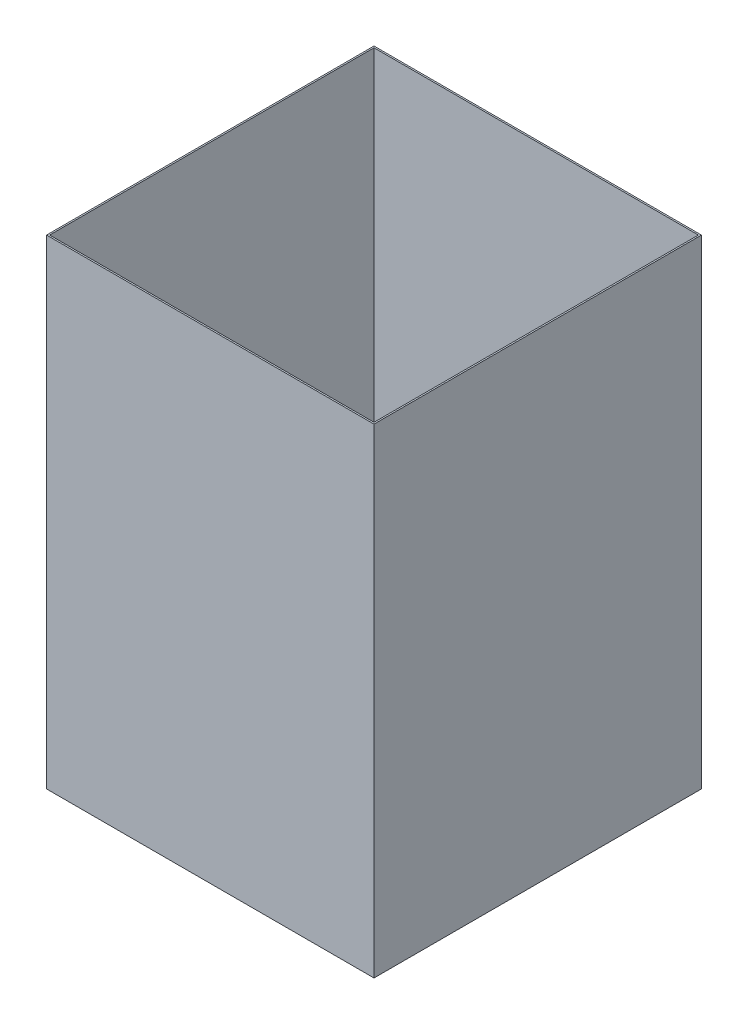
ISO-10303-21;
HEADER;
FILE_DESCRIPTION(('STEP AP214'),'2;1');
FILE_NAME('part.step','',(''),(''),'','','');
FILE_SCHEMA(('AUTOMOTIVE_DESIGN { 1 0 10303 214 1 1 1 1 }'));
ENDSEC;
DATA;
#1=APPLICATION_CONTEXT('core data for automotive mechanical design processes');
#2=APPLICATION_PROTOCOL_DEFINITION('international standard','automotive_design',2000,#1);
#3=PRODUCT_CONTEXT('',#1,'mechanical');
#4=PRODUCT('Part','Part','',(#3));
#5=PRODUCT_RELATED_PRODUCT_CATEGORY('part','',(#4));
#6=PRODUCT_DEFINITION_FORMATION('','',#4);
#7=PRODUCT_DEFINITION_CONTEXT('part definition',#1,'design');
#8=PRODUCT_DEFINITION('design','',#6,#7);
#9=PRODUCT_DEFINITION_SHAPE('','',#8);
#10=(LENGTH_UNIT() NAMED_UNIT(*) SI_UNIT(.MILLI.,.METRE.));
#11=(NAMED_UNIT(*) PLANE_ANGLE_UNIT() SI_UNIT($,.RADIAN.));
#12=(NAMED_UNIT(*) SI_UNIT($,.STERADIAN.) SOLID_ANGLE_UNIT());
#13=UNCERTAINTY_MEASURE_WITH_UNIT(LENGTH_MEASURE(1.E-05),#10,'distance_accuracy_value','');
#14=(GEOMETRIC_REPRESENTATION_CONTEXT(3) GLOBAL_UNCERTAINTY_ASSIGNED_CONTEXT((#13)) GLOBAL_UNIT_ASSIGNED_CONTEXT((#10,
#11,#12)) REPRESENTATION_CONTEXT('',''));
#15=CARTESIAN_POINT('',(0.,0.,0.));
#16=DIRECTION('',(0.,0.,1.));
#17=DIRECTION('',(1.,0.,0.));
#18=AXIS2_PLACEMENT_3D('',#15,#16,#17);
#19=CARTESIAN_POINT('',(0.,630.,0.));
#20=DIRECTION('',(0.,-1.,0.));
#21=DIRECTION('',(0.,0.,-1.));
#22=AXIS2_PLACEMENT_3D('',#19,#20,#21);
#23=PLANE('',#22);
#24=DIRECTION('',(0.,0.,-1.));
#25=VECTOR('',#24,1.);
#26=CARTESIAN_POINT('',(215.,630.,215.));
#27=LINE('',#26,#25);
#28=CARTESIAN_POINT('',(215.,630.,215.));
#29=VERTEX_POINT('',#28);
#30=CARTESIAN_POINT('',(215.,630.,-215.));
#31=VERTEX_POINT('',#30);
#32=EDGE_CURVE('E141',#29,#31,#27,.T.);
#33=ORIENTED_EDGE('',*,*,#32,.T.);
#34=DIRECTION('',(-1.,0.,0.));
#35=VECTOR('',#34,1.);
#36=CARTESIAN_POINT('',(-215.,630.,-215.));
#37=LINE('',#36,#35);
#38=CARTESIAN_POINT('',(-215.,630.,-215.));
#39=VERTEX_POINT('',#38);
#40=EDGE_CURVE('E85',#31,#39,#37,.T.);
#41=ORIENTED_EDGE('',*,*,#40,.T.);
#42=DIRECTION('',(0.,0.,1.));
#43=VECTOR('',#42,1.);
#44=CARTESIAN_POINT('',(-215.,630.,215.));
#45=LINE('',#44,#43);
#46=CARTESIAN_POINT('',(-215.,630.,215.));
#47=VERTEX_POINT('',#46);
#48=EDGE_CURVE('E144',#39,#47,#45,.T.);
#49=ORIENTED_EDGE('',*,*,#48,.T.);
#50=DIRECTION('',(1.,0.,0.));
#51=VECTOR('',#50,1.);
#52=CARTESIAN_POINT('',(-215.,630.,215.));
#53=LINE('',#52,#51);
#54=EDGE_CURVE('E57',#47,#29,#53,.T.);
#55=ORIENTED_EDGE('',*,*,#54,.T.);
#56=EDGE_LOOP('',(#33,#41,#49,#55));
#57=FACE_BOUND('',#56,.T.);
#58=DIRECTION('',(0.,0.,-1.));
#59=VECTOR('',#58,1.);
#60=CARTESIAN_POINT('',(213.,630.,0.));
#61=LINE('',#60,#59);
#62=CARTESIAN_POINT('',(213.,630.,213.));
#63=VERTEX_POINT('',#62);
#64=CARTESIAN_POINT('',(213.,630.,-213.));
#65=VERTEX_POINT('',#64);
#66=EDGE_CURVE('E130',#63,#65,#61,.T.);
#67=ORIENTED_EDGE('',*,*,#66,.F.);
#68=DIRECTION('',(1.,0.,0.));
#69=VECTOR('',#68,1.);
#70=CARTESIAN_POINT('',(0.,630.,213.));
#71=LINE('',#70,#69);
#72=CARTESIAN_POINT('',(-213.,630.,213.));
#73=VERTEX_POINT('',#72);
#74=EDGE_CURVE('E139',#73,#63,#71,.T.);
#75=ORIENTED_EDGE('',*,*,#74,.F.);
#76=DIRECTION('',(0.,0.,1.));
#77=VECTOR('',#76,1.);
#78=CARTESIAN_POINT('',(-213.,630.,0.));
#79=LINE('',#78,#77);
#80=CARTESIAN_POINT('',(-213.,630.,-213.));
#81=VERTEX_POINT('',#80);
#82=EDGE_CURVE('E137',#81,#73,#79,.T.);
#83=ORIENTED_EDGE('',*,*,#82,.F.);
#84=DIRECTION('',(-1.,0.,0.));
#85=VECTOR('',#84,1.);
#86=CARTESIAN_POINT('',(0.,630.,-213.));
#87=LINE('',#86,#85);
#88=EDGE_CURVE('E122',#65,#81,#87,.T.);
#89=ORIENTED_EDGE('',*,*,#88,.F.);
#90=EDGE_LOOP('',(#67,#75,#83,#89));
#91=FACE_BOUND('',#90,.T.);
#92=ADVANCED_FACE('F33',(#57,#91),#23,.F.);
#93=CARTESIAN_POINT('',(215.,630.,215.));
#94=DIRECTION('',(-1.,0.,0.));
#95=DIRECTION('',(0.,0.,1.));
#96=AXIS2_PLACEMENT_3D('',#93,#94,#95);
#97=PLANE('',#96);
#98=DIRECTION('',(0.,0.,-1.));
#99=VECTOR('',#98,1.);
#100=CARTESIAN_POINT('',(215.,0.,215.));
#101=LINE('',#100,#99);
#102=CARTESIAN_POINT('',(215.,0.,215.));
#103=VERTEX_POINT('',#102);
#104=CARTESIAN_POINT('',(215.,0.,-215.));
#105=VERTEX_POINT('',#104);
#106=EDGE_CURVE('E148',#103,#105,#101,.T.);
#107=ORIENTED_EDGE('',*,*,#106,.T.);
#108=DIRECTION('',(0.,-1.,0.));
#109=VECTOR('',#108,1.);
#110=CARTESIAN_POINT('',(215.,630.,-215.));
#111=LINE('',#110,#109);
#112=EDGE_CURVE('E11',#31,#105,#111,.T.);
#113=ORIENTED_EDGE('',*,*,#112,.F.);
#114=ORIENTED_EDGE('',*,*,#32,.F.);
#115=DIRECTION('',(0.,-1.,0.));
#116=VECTOR('',#115,1.);
#117=CARTESIAN_POINT('',(215.,630.,215.));
#118=LINE('',#117,#116);
#119=EDGE_CURVE('E147',#29,#103,#118,.T.);
#120=ORIENTED_EDGE('',*,*,#119,.T.);
#121=EDGE_LOOP('',(#107,#113,#114,#120));
#122=FACE_BOUND('',#121,.T.);
#123=ADVANCED_FACE('F35',(#122),#97,.F.);
#124=CARTESIAN_POINT('',(-215.,630.,-215.));
#125=DIRECTION('',(0.,0.,1.));
#126=DIRECTION('',(1.,0.,0.));
#127=AXIS2_PLACEMENT_3D('',#124,#125,#126);
#128=PLANE('',#127);
#129=DIRECTION('',(-1.,0.,0.));
#130=VECTOR('',#129,1.);
#131=CARTESIAN_POINT('',(-215.,0.,-215.));
#132=LINE('',#131,#130);
#133=CARTESIAN_POINT('',(-215.,0.,-215.));
#134=VERTEX_POINT('',#133);
#135=EDGE_CURVE('E151',#105,#134,#132,.T.);
#136=ORIENTED_EDGE('',*,*,#135,.T.);
#137=DIRECTION('',(0.,-1.,0.));
#138=VECTOR('',#137,1.);
#139=CARTESIAN_POINT('',(-215.,630.,-215.));
#140=LINE('',#139,#138);
#141=EDGE_CURVE('E41',#39,#134,#140,.T.);
#142=ORIENTED_EDGE('',*,*,#141,.F.);
#143=ORIENTED_EDGE('',*,*,#40,.F.);
#144=ORIENTED_EDGE('',*,*,#112,.T.);
#145=EDGE_LOOP('',(#136,#142,#143,#144));
#146=FACE_BOUND('',#145,.T.);
#147=ADVANCED_FACE('F179',(#146),#128,.F.);
#148=CARTESIAN_POINT('',(-215.,630.,215.));
#149=DIRECTION('',(1.,0.,0.));
#150=DIRECTION('',(0.,0.,-1.));
#151=AXIS2_PLACEMENT_3D('',#148,#149,#150);
#152=PLANE('',#151);
#153=DIRECTION('',(0.,0.,1.));
#154=VECTOR('',#153,1.);
#155=CARTESIAN_POINT('',(-215.,0.,215.));
#156=LINE('',#155,#154);
#157=CARTESIAN_POINT('',(-215.,0.,215.));
#158=VERTEX_POINT('',#157);
#159=EDGE_CURVE('E153',#134,#158,#156,.T.);
#160=ORIENTED_EDGE('',*,*,#159,.T.);
#161=DIRECTION('',(0.,-1.,0.));
#162=VECTOR('',#161,1.);
#163=CARTESIAN_POINT('',(-215.,630.,215.));
#164=LINE('',#163,#162);
#165=EDGE_CURVE('E157',#47,#158,#164,.T.);
#166=ORIENTED_EDGE('',*,*,#165,.F.);
#167=ORIENTED_EDGE('',*,*,#48,.F.);
#168=ORIENTED_EDGE('',*,*,#141,.T.);
#169=EDGE_LOOP('',(#160,#166,#167,#168));
#170=FACE_BOUND('',#169,.T.);
#171=ADVANCED_FACE('F162',(#170),#152,.F.);
#172=CARTESIAN_POINT('',(-215.,630.,215.));
#173=DIRECTION('',(0.,0.,-1.));
#174=DIRECTION('',(-1.,0.,0.));
#175=AXIS2_PLACEMENT_3D('',#172,#173,#174);
#176=PLANE('',#175);
#177=DIRECTION('',(1.,0.,0.));
#178=VECTOR('',#177,1.);
#179=CARTESIAN_POINT('',(-215.,0.,215.));
#180=LINE('',#179,#178);
#181=EDGE_CURVE('E78',#158,#103,#180,.T.);
#182=ORIENTED_EDGE('',*,*,#181,.T.);
#183=ORIENTED_EDGE('',*,*,#119,.F.);
#184=ORIENTED_EDGE('',*,*,#54,.F.);
#185=ORIENTED_EDGE('',*,*,#165,.T.);
#186=EDGE_LOOP('',(#182,#183,#184,#185));
#187=FACE_BOUND('',#186,.T.);
#188=ADVANCED_FACE('F170',(#187),#176,.F.);
#189=CARTESIAN_POINT('',(0.,0.,0.));
#190=DIRECTION('',(0.,-1.,0.));
#191=DIRECTION('',(0.,0.,-1.));
#192=AXIS2_PLACEMENT_3D('',#189,#190,#191);
#193=PLANE('',#192);
#194=ORIENTED_EDGE('',*,*,#106,.F.);
#195=ORIENTED_EDGE('',*,*,#181,.F.);
#196=ORIENTED_EDGE('',*,*,#159,.F.);
#197=ORIENTED_EDGE('',*,*,#135,.F.);
#198=EDGE_LOOP('',(#194,#195,#196,#197));
#199=FACE_BOUND('',#198,.T.);
#200=ADVANCED_FACE('F166',(#199),#193,.T.);
#201=CARTESIAN_POINT('',(213.,630.,215.));
#202=DIRECTION('',(-1.,0.,0.));
#203=DIRECTION('',(0.,0.,1.));
#204=AXIS2_PLACEMENT_3D('',#201,#202,#203);
#205=PLANE('',#204);
#206=DIRECTION('',(0.,0.,-1.));
#207=VECTOR('',#206,1.);
#208=CARTESIAN_POINT('',(213.,2.,0.));
#209=LINE('',#208,#207);
#210=CARTESIAN_POINT('',(213.,2.,213.));
#211=VERTEX_POINT('',#210);
#212=CARTESIAN_POINT('',(213.,2.,-213.));
#213=VERTEX_POINT('',#212);
#214=EDGE_CURVE('E113',#211,#213,#209,.T.);
#215=ORIENTED_EDGE('',*,*,#214,.F.);
#216=DIRECTION('',(0.,-1.,0.));
#217=VECTOR('',#216,1.);
#218=CARTESIAN_POINT('',(213.,630.,213.));
#219=LINE('',#218,#217);
#220=EDGE_CURVE('E133',#63,#211,#219,.T.);
#221=ORIENTED_EDGE('',*,*,#220,.F.);
#222=ORIENTED_EDGE('',*,*,#66,.T.);
#223=DIRECTION('',(0.,-1.,0.));
#224=VECTOR('',#223,1.);
#225=CARTESIAN_POINT('',(213.,630.,-213.));
#226=LINE('',#225,#224);
#227=EDGE_CURVE('E125',#65,#213,#226,.T.);
#228=ORIENTED_EDGE('',*,*,#227,.T.);
#229=EDGE_LOOP('',(#215,#221,#222,#228));
#230=FACE_BOUND('',#229,.T.);
#231=ADVANCED_FACE('F177',(#230),#205,.T.);
#232=CARTESIAN_POINT('',(-215.,630.,-213.));
#233=DIRECTION('',(0.,0.,1.));
#234=DIRECTION('',(1.,0.,0.));
#235=AXIS2_PLACEMENT_3D('',#232,#233,#234);
#236=PLANE('',#235);
#237=DIRECTION('',(-1.,0.,0.));
#238=VECTOR('',#237,1.);
#239=CARTESIAN_POINT('',(0.,2.,-213.));
#240=LINE('',#239,#238);
#241=CARTESIAN_POINT('',(-213.,2.,-213.));
#242=VERTEX_POINT('',#241);
#243=EDGE_CURVE('E107',#213,#242,#240,.T.);
#244=ORIENTED_EDGE('',*,*,#243,.F.);
#245=ORIENTED_EDGE('',*,*,#227,.F.);
#246=ORIENTED_EDGE('',*,*,#88,.T.);
#247=DIRECTION('',(0.,-1.,0.));
#248=VECTOR('',#247,1.);
#249=CARTESIAN_POINT('',(-213.,630.,-213.));
#250=LINE('',#249,#248);
#251=EDGE_CURVE('E119',#81,#242,#250,.T.);
#252=ORIENTED_EDGE('',*,*,#251,.T.);
#253=EDGE_LOOP('',(#244,#245,#246,#252));
#254=FACE_BOUND('',#253,.T.);
#255=ADVANCED_FACE('F120',(#254),#236,.T.);
#256=CARTESIAN_POINT('',(-213.,630.,215.));
#257=DIRECTION('',(1.,0.,0.));
#258=DIRECTION('',(0.,0.,-1.));
#259=AXIS2_PLACEMENT_3D('',#256,#257,#258);
#260=PLANE('',#259);
#261=DIRECTION('',(0.,0.,1.));
#262=VECTOR('',#261,1.);
#263=CARTESIAN_POINT('',(-213.,2.,0.));
#264=LINE('',#263,#262);
#265=CARTESIAN_POINT('',(-213.,2.,213.));
#266=VERTEX_POINT('',#265);
#267=EDGE_CURVE('E111',#242,#266,#264,.T.);
#268=ORIENTED_EDGE('',*,*,#267,.F.);
#269=ORIENTED_EDGE('',*,*,#251,.F.);
#270=ORIENTED_EDGE('',*,*,#82,.T.);
#271=DIRECTION('',(0.,-1.,0.));
#272=VECTOR('',#271,1.);
#273=CARTESIAN_POINT('',(-213.,630.,213.));
#274=LINE('',#273,#272);
#275=EDGE_CURVE('E48',#73,#266,#274,.T.);
#276=ORIENTED_EDGE('',*,*,#275,.T.);
#277=EDGE_LOOP('',(#268,#269,#270,#276));
#278=FACE_BOUND('',#277,.T.);
#279=ADVANCED_FACE('F127',(#278),#260,.T.);
#280=CARTESIAN_POINT('',(-215.,630.,213.));
#281=DIRECTION('',(0.,0.,-1.));
#282=DIRECTION('',(-1.,0.,0.));
#283=AXIS2_PLACEMENT_3D('',#280,#281,#282);
#284=PLANE('',#283);
#285=DIRECTION('',(1.,0.,0.));
#286=VECTOR('',#285,1.);
#287=CARTESIAN_POINT('',(0.,2.,213.));
#288=LINE('',#287,#286);
#289=EDGE_CURVE('E128',#266,#211,#288,.T.);
#290=ORIENTED_EDGE('',*,*,#289,.F.);
#291=ORIENTED_EDGE('',*,*,#275,.F.);
#292=ORIENTED_EDGE('',*,*,#74,.T.);
#293=ORIENTED_EDGE('',*,*,#220,.T.);
#294=EDGE_LOOP('',(#290,#291,#292,#293));
#295=FACE_BOUND('',#294,.T.);
#296=ADVANCED_FACE('F190',(#295),#284,.T.);
#297=CARTESIAN_POINT('',(0.,2.,0.));
#298=DIRECTION('',(0.,-1.,0.));
#299=DIRECTION('',(0.,0.,-1.));
#300=AXIS2_PLACEMENT_3D('',#297,#298,#299);
#301=PLANE('',#300);
#302=ORIENTED_EDGE('',*,*,#214,.T.);
#303=ORIENTED_EDGE('',*,*,#243,.T.);
#304=ORIENTED_EDGE('',*,*,#267,.T.);
#305=ORIENTED_EDGE('',*,*,#289,.T.);
#306=EDGE_LOOP('',(#302,#303,#304,#305));
#307=FACE_BOUND('',#306,.T.);
#308=ADVANCED_FACE('F109',(#307),#301,.F.);
#309=CLOSED_SHELL('',(#92,#123,#147,#171,#188,#200,#231,#255,#279,#296,#308));
#310=MANIFOLD_SOLID_BREP('B2',#309);
#311=ADVANCED_BREP_SHAPE_REPRESENTATION('',(#18,#310),#14);
#312=SHAPE_DEFINITION_REPRESENTATION(#9,#311);
ENDSEC;
END-ISO-10303-21;
